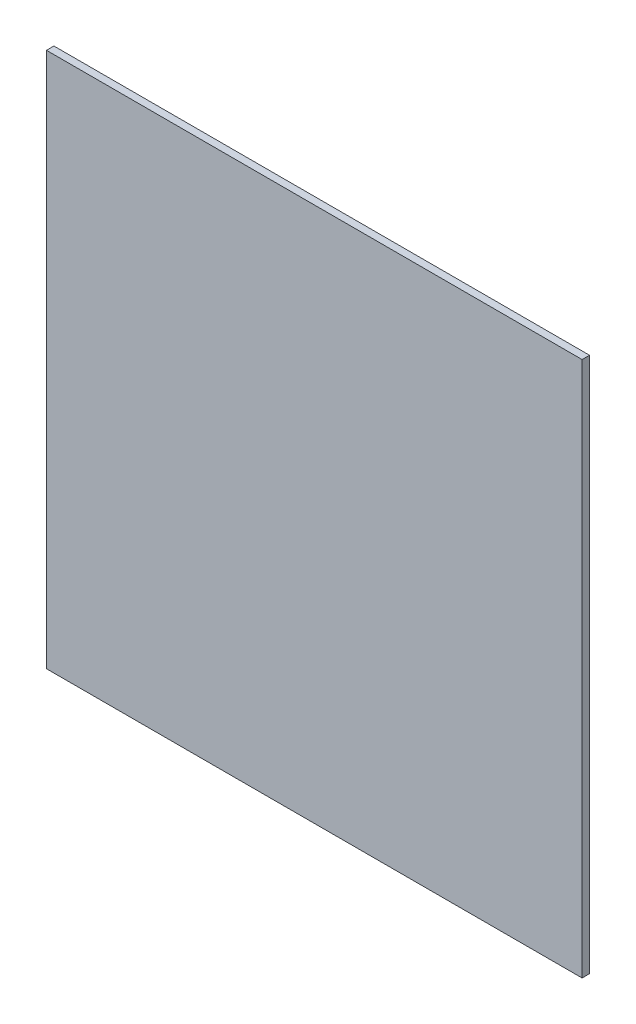
ISO-10303-21;
HEADER;
FILE_DESCRIPTION(('STEP AP214'),'2;1');
FILE_NAME('part.step','',(''),(''),'','','');
FILE_SCHEMA(('AUTOMOTIVE_DESIGN { 1 0 10303 214 1 1 1 1 }'));
ENDSEC;
DATA;
#1=APPLICATION_CONTEXT('core data for automotive mechanical design processes');
#2=APPLICATION_PROTOCOL_DEFINITION('international standard','automotive_design',2000,#1);
#3=PRODUCT_CONTEXT('',#1,'mechanical');
#4=PRODUCT('Part','Part','',(#3));
#5=PRODUCT_RELATED_PRODUCT_CATEGORY('part','',(#4));
#6=PRODUCT_DEFINITION_FORMATION('','',#4);
#7=PRODUCT_DEFINITION_CONTEXT('part definition',#1,'design');
#8=PRODUCT_DEFINITION('design','',#6,#7);
#9=PRODUCT_DEFINITION_SHAPE('','',#8);
#10=(LENGTH_UNIT() NAMED_UNIT(*) SI_UNIT(.MILLI.,.METRE.));
#11=(NAMED_UNIT(*) PLANE_ANGLE_UNIT() SI_UNIT($,.RADIAN.));
#12=(NAMED_UNIT(*) SI_UNIT($,.STERADIAN.) SOLID_ANGLE_UNIT());
#13=UNCERTAINTY_MEASURE_WITH_UNIT(LENGTH_MEASURE(1.E-05),#10,'distance_accuracy_value','');
#14=(GEOMETRIC_REPRESENTATION_CONTEXT(3) GLOBAL_UNCERTAINTY_ASSIGNED_CONTEXT((#13)) GLOBAL_UNIT_ASSIGNED_CONTEXT((#10,
#11,#12)) REPRESENTATION_CONTEXT('',''));
#15=CARTESIAN_POINT('',(0.,0.,0.));
#16=DIRECTION('',(0.,0.,1.));
#17=DIRECTION('',(1.,0.,0.));
#18=AXIS2_PLACEMENT_3D('',#15,#16,#17);
#19=CARTESIAN_POINT('',(-146.953363697867,1527.30975301925,6.35));
#20=DIRECTION('',(1.,0.,0.));
#21=DIRECTION('',(0.,1.,0.));
#22=AXIS2_PLACEMENT_3D('',#19,#20,#21);
#23=PLANE('',#22);
#24=DIRECTION('',(0.,-1.,0.));
#25=VECTOR('',#24,1.);
#26=CARTESIAN_POINT('',(-146.953363697867,1527.30975301925,0.));
#27=LINE('',#26,#25);
#28=CARTESIAN_POINT('',(-146.953363697867,1527.30975301925,0.));
#29=VERTEX_POINT('',#28);
#30=CARTESIAN_POINT('',(-146.953363697867,1070.10975301925,0.));
#31=VERTEX_POINT('',#30);
#32=EDGE_CURVE('E96',#29,#31,#27,.T.);
#33=ORIENTED_EDGE('',*,*,#32,.T.);
#34=DIRECTION('',(0.,0.,-1.));
#35=VECTOR('',#34,1.);
#36=CARTESIAN_POINT('',(-146.953363697867,1070.10975301925,6.35));
#37=LINE('',#36,#35);
#38=CARTESIAN_POINT('',(-146.953363697867,1070.10975301925,6.35));
#39=VERTEX_POINT('',#38);
#40=EDGE_CURVE('E11',#39,#31,#37,.T.);
#41=ORIENTED_EDGE('',*,*,#40,.F.);
#42=DIRECTION('',(0.,-1.,0.));
#43=VECTOR('',#42,1.);
#44=CARTESIAN_POINT('',(-146.953363697867,1527.30975301925,6.35));
#45=LINE('',#44,#43);
#46=CARTESIAN_POINT('',(-146.953363697867,1527.30975301925,6.35));
#47=VERTEX_POINT('',#46);
#48=EDGE_CURVE('E84',#47,#39,#45,.T.);
#49=ORIENTED_EDGE('',*,*,#48,.F.);
#50=DIRECTION('',(0.,0.,-1.));
#51=VECTOR('',#50,1.);
#52=CARTESIAN_POINT('',(-146.953363697867,1527.30975301925,6.35));
#53=LINE('',#52,#51);
#54=EDGE_CURVE('E92',#47,#29,#53,.T.);
#55=ORIENTED_EDGE('',*,*,#54,.T.);
#56=EDGE_LOOP('',(#33,#41,#49,#55));
#57=FACE_BOUND('',#56,.T.);
#58=ADVANCED_FACE('F33',(#57),#23,.F.);
#59=CARTESIAN_POINT('',(-146.953363697867,1070.10975301925,6.35));
#60=DIRECTION('',(0.,1.,0.));
#61=DIRECTION('',(0.,0.,1.));
#62=AXIS2_PLACEMENT_3D('',#59,#60,#61);
#63=PLANE('',#62);
#64=DIRECTION('',(1.,0.,0.));
#65=VECTOR('',#64,1.);
#66=CARTESIAN_POINT('',(-146.953363697867,1070.10975301925,0.));
#67=LINE('',#66,#65);
#68=CARTESIAN_POINT('',(310.246636302133,1070.10975301925,0.));
#69=VERTEX_POINT('',#68);
#70=EDGE_CURVE('E88',#31,#69,#67,.T.);
#71=ORIENTED_EDGE('',*,*,#70,.T.);
#72=DIRECTION('',(0.,0.,-1.));
#73=VECTOR('',#72,1.);
#74=CARTESIAN_POINT('',(310.246636302133,1070.10975301925,6.35));
#75=LINE('',#74,#73);
#76=CARTESIAN_POINT('',(310.246636302133,1070.10975301925,6.35));
#77=VERTEX_POINT('',#76);
#78=EDGE_CURVE('E41',#77,#69,#75,.T.);
#79=ORIENTED_EDGE('',*,*,#78,.F.);
#80=DIRECTION('',(1.,0.,0.));
#81=VECTOR('',#80,1.);
#82=CARTESIAN_POINT('',(-146.953363697867,1070.10975301925,6.35));
#83=LINE('',#82,#81);
#84=EDGE_CURVE('E79',#39,#77,#83,.T.);
#85=ORIENTED_EDGE('',*,*,#84,.F.);
#86=ORIENTED_EDGE('',*,*,#40,.T.);
#87=EDGE_LOOP('',(#71,#79,#85,#86));
#88=FACE_BOUND('',#87,.T.);
#89=ADVANCED_FACE('F87',(#88),#63,.F.);
#90=CARTESIAN_POINT('',(310.246636302133,1527.30975301925,6.35));
#91=DIRECTION('',(-1.,0.,0.));
#92=DIRECTION('',(0.,0.,1.));
#93=AXIS2_PLACEMENT_3D('',#90,#91,#92);
#94=PLANE('',#93);
#95=DIRECTION('',(0.,1.,0.));
#96=VECTOR('',#95,1.);
#97=CARTESIAN_POINT('',(310.246636302133,1527.30975301925,0.));
#98=LINE('',#97,#96);
#99=CARTESIAN_POINT('',(310.246636302133,1527.30975301925,0.));
#100=VERTEX_POINT('',#99);
#101=EDGE_CURVE('E66',#69,#100,#98,.T.);
#102=ORIENTED_EDGE('',*,*,#101,.T.);
#103=DIRECTION('',(0.,0.,-1.));
#104=VECTOR('',#103,1.);
#105=CARTESIAN_POINT('',(310.246636302133,1527.30975301925,6.35));
#106=LINE('',#105,#104);
#107=CARTESIAN_POINT('',(310.246636302133,1527.30975301925,6.35));
#108=VERTEX_POINT('',#107);
#109=EDGE_CURVE('E89',#108,#100,#106,.T.);
#110=ORIENTED_EDGE('',*,*,#109,.F.);
#111=DIRECTION('',(0.,1.,0.));
#112=VECTOR('',#111,1.);
#113=CARTESIAN_POINT('',(310.246636302133,1527.30975301925,6.35));
#114=LINE('',#113,#112);
#115=EDGE_CURVE('E82',#77,#108,#114,.T.);
#116=ORIENTED_EDGE('',*,*,#115,.F.);
#117=ORIENTED_EDGE('',*,*,#78,.T.);
#118=EDGE_LOOP('',(#102,#110,#116,#117));
#119=FACE_BOUND('',#118,.T.);
#120=ADVANCED_FACE('F90',(#119),#94,.F.);
#121=CARTESIAN_POINT('',(-146.953363697867,1527.30975301925,6.35));
#122=DIRECTION('',(0.,-1.,0.));
#123=DIRECTION('',(0.,0.,-1.));
#124=AXIS2_PLACEMENT_3D('',#121,#122,#123);
#125=PLANE('',#124);
#126=DIRECTION('',(-1.,0.,0.));
#127=VECTOR('',#126,1.);
#128=CARTESIAN_POINT('',(-146.953363697867,1527.30975301925,0.));
#129=LINE('',#128,#127);
#130=EDGE_CURVE('E72',#100,#29,#129,.T.);
#131=ORIENTED_EDGE('',*,*,#130,.T.);
#132=ORIENTED_EDGE('',*,*,#54,.F.);
#133=DIRECTION('',(-1.,0.,0.));
#134=VECTOR('',#133,1.);
#135=CARTESIAN_POINT('',(-146.953363697867,1527.30975301925,6.35));
#136=LINE('',#135,#134);
#137=EDGE_CURVE('E49',#108,#47,#136,.T.);
#138=ORIENTED_EDGE('',*,*,#137,.F.);
#139=ORIENTED_EDGE('',*,*,#109,.T.);
#140=EDGE_LOOP('',(#131,#132,#138,#139));
#141=FACE_BOUND('',#140,.T.);
#142=ADVANCED_FACE('F103',(#141),#125,.F.);
#143=CARTESIAN_POINT('',(-146.953363697867,1070.10975301925,6.35));
#144=DIRECTION('',(0.,0.,1.));
#145=DIRECTION('',(1.,0.,0.));
#146=AXIS2_PLACEMENT_3D('',#143,#144,#145);
#147=PLANE('',#146);
#148=ORIENTED_EDGE('',*,*,#48,.T.);
#149=ORIENTED_EDGE('',*,*,#84,.T.);
#150=ORIENTED_EDGE('',*,*,#115,.T.);
#151=ORIENTED_EDGE('',*,*,#137,.T.);
#152=EDGE_LOOP('',(#148,#149,#150,#151));
#153=FACE_BOUND('',#152,.T.);
#154=ADVANCED_FACE('F80',(#153),#147,.T.);
#155=CARTESIAN_POINT('',(-146.953363697867,1070.10975301925,0.));
#156=DIRECTION('',(0.,0.,1.));
#157=DIRECTION('',(1.,0.,0.));
#158=AXIS2_PLACEMENT_3D('',#155,#156,#157);
#159=PLANE('',#158);
#160=ORIENTED_EDGE('',*,*,#32,.F.);
#161=ORIENTED_EDGE('',*,*,#130,.F.);
#162=ORIENTED_EDGE('',*,*,#101,.F.);
#163=ORIENTED_EDGE('',*,*,#70,.F.);
#164=EDGE_LOOP('',(#160,#161,#162,#163));
#165=FACE_BOUND('',#164,.T.);
#166=ADVANCED_FACE('F106',(#165),#159,.F.);
#167=CLOSED_SHELL('',(#58,#89,#120,#142,#154,#166));
#168=MANIFOLD_SOLID_BREP('B2',#167);
#169=ADVANCED_BREP_SHAPE_REPRESENTATION('',(#18,#168),#14);
#170=SHAPE_DEFINITION_REPRESENTATION(#9,#169);
ENDSEC;
END-ISO-10303-21;
